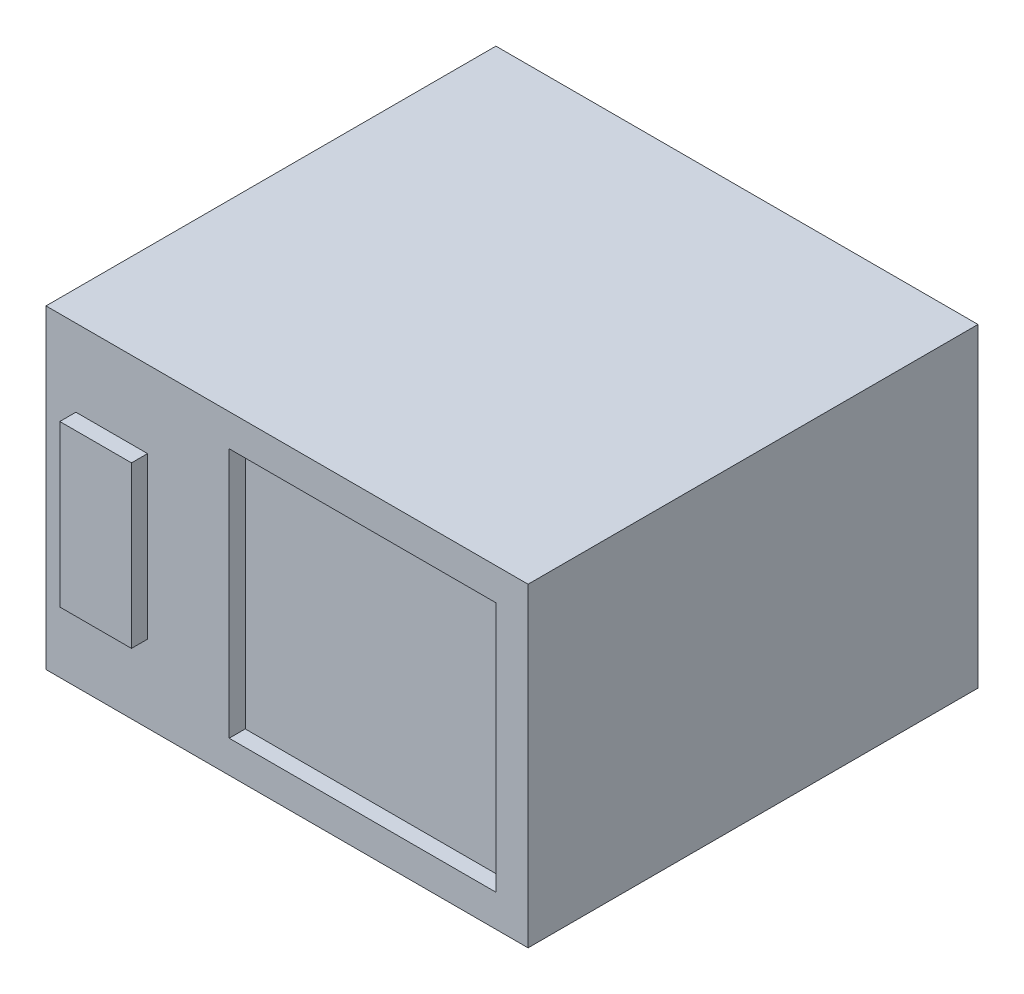
ISO-10303-21;
HEADER;
FILE_DESCRIPTION(('STEP AP214'),'2;1');
FILE_NAME('part.step','',(''),(''),'','','');
FILE_SCHEMA(('AUTOMOTIVE_DESIGN { 1 0 10303 214 1 1 1 1 }'));
ENDSEC;
DATA;
#1=APPLICATION_CONTEXT('core data for automotive mechanical design processes');
#2=APPLICATION_PROTOCOL_DEFINITION('international standard','automotive_design',2000,#1);
#3=PRODUCT_CONTEXT('',#1,'mechanical');
#4=PRODUCT('Part','Part','',(#3));
#5=PRODUCT_RELATED_PRODUCT_CATEGORY('part','',(#4));
#6=PRODUCT_DEFINITION_FORMATION('','',#4);
#7=PRODUCT_DEFINITION_CONTEXT('part definition',#1,'design');
#8=PRODUCT_DEFINITION('design','',#6,#7);
#9=PRODUCT_DEFINITION_SHAPE('','',#8);
#10=(LENGTH_UNIT() NAMED_UNIT(*) SI_UNIT(.MILLI.,.METRE.));
#11=(NAMED_UNIT(*) PLANE_ANGLE_UNIT() SI_UNIT($,.RADIAN.));
#12=(NAMED_UNIT(*) SI_UNIT($,.STERADIAN.) SOLID_ANGLE_UNIT());
#13=UNCERTAINTY_MEASURE_WITH_UNIT(LENGTH_MEASURE(1.E-05),#10,'distance_accuracy_value','');
#14=(GEOMETRIC_REPRESENTATION_CONTEXT(3) GLOBAL_UNCERTAINTY_ASSIGNED_CONTEXT((#13)) GLOBAL_UNIT_ASSIGNED_CONTEXT((#10,
#11,#12)) REPRESENTATION_CONTEXT('',''));
#15=CARTESIAN_POINT('',(0.,0.,0.));
#16=DIRECTION('',(0.,0.,1.));
#17=DIRECTION('',(1.,0.,0.));
#18=AXIS2_PLACEMENT_3D('',#15,#16,#17);
#19=CARTESIAN_POINT('',(-75.,49.,70.));
#20=DIRECTION('',(0.,0.,-1.));
#21=DIRECTION('',(-1.,0.,0.));
#22=AXIS2_PLACEMENT_3D('',#19,#20,#21);
#23=PLANE('',#22);
#24=DIRECTION('',(1.,0.,0.));
#25=VECTOR('',#24,1.);
#26=CARTESIAN_POINT('',(-75.,-49.,70.));
#27=LINE('',#26,#25);
#28=CARTESIAN_POINT('',(-75.,-49.,70.));
#29=VERTEX_POINT('',#28);
#30=CARTESIAN_POINT('',(75.,-49.,70.));
#31=VERTEX_POINT('',#30);
#32=EDGE_CURVE('E295',#29,#31,#27,.T.);
#33=ORIENTED_EDGE('',*,*,#32,.T.);
#34=DIRECTION('',(0.,-1.,0.));
#35=VECTOR('',#34,1.);
#36=CARTESIAN_POINT('',(75.,49.,70.));
#37=LINE('',#36,#35);
#38=CARTESIAN_POINT('',(75.,49.,70.));
#39=VERTEX_POINT('',#38);
#40=EDGE_CURVE('E304',#39,#31,#37,.T.);
#41=ORIENTED_EDGE('',*,*,#40,.F.);
#42=DIRECTION('',(1.,0.,0.));
#43=VECTOR('',#42,1.);
#44=CARTESIAN_POINT('',(-75.,49.,70.));
#45=LINE('',#44,#43);
#46=CARTESIAN_POINT('',(-75.,49.,70.));
#47=VERTEX_POINT('',#46);
#48=EDGE_CURVE('E301',#47,#39,#45,.T.);
#49=ORIENTED_EDGE('',*,*,#48,.F.);
#50=DIRECTION('',(0.,-1.,0.));
#51=VECTOR('',#50,1.);
#52=CARTESIAN_POINT('',(-75.,49.,70.));
#53=LINE('',#52,#51);
#54=EDGE_CURVE('E319',#47,#29,#53,.T.);
#55=ORIENTED_EDGE('',*,*,#54,.T.);
#56=EDGE_LOOP('',(#33,#41,#49,#55));
#57=FACE_BOUND('',#56,.T.);
#58=DIRECTION('',(1.,0.,0.));
#59=VECTOR('',#58,1.);
#60=CARTESIAN_POINT('',(-18.,-39.,70.));
#61=LINE('',#60,#59);
#62=CARTESIAN_POINT('',(-18.,-39.,70.));
#63=VERTEX_POINT('',#62);
#64=CARTESIAN_POINT('',(65.,-39.,70.));
#65=VERTEX_POINT('',#64);
#66=EDGE_CURVE('E266',#63,#65,#61,.T.);
#67=ORIENTED_EDGE('',*,*,#66,.F.);
#68=DIRECTION('',(0.,-1.,0.));
#69=VECTOR('',#68,1.);
#70=CARTESIAN_POINT('',(-18.,39.,70.));
#71=LINE('',#70,#69);
#72=CARTESIAN_POINT('',(-18.,39.,70.));
#73=VERTEX_POINT('',#72);
#74=EDGE_CURVE('E245',#73,#63,#71,.T.);
#75=ORIENTED_EDGE('',*,*,#74,.F.);
#76=DIRECTION('',(-1.,0.,0.));
#77=VECTOR('',#76,1.);
#78=CARTESIAN_POINT('',(-18.,39.,70.));
#79=LINE('',#78,#77);
#80=CARTESIAN_POINT('',(65.,39.,70.));
#81=VERTEX_POINT('',#80);
#82=EDGE_CURVE('E251',#81,#73,#79,.T.);
#83=ORIENTED_EDGE('',*,*,#82,.F.);
#84=DIRECTION('',(0.,1.,0.));
#85=VECTOR('',#84,1.);
#86=CARTESIAN_POINT('',(65.,39.,70.));
#87=LINE('',#86,#85);
#88=EDGE_CURVE('E270',#65,#81,#87,.T.);
#89=ORIENTED_EDGE('',*,*,#88,.F.);
#90=EDGE_LOOP('',(#67,#75,#83,#89));
#91=FACE_BOUND('',#90,.T.);
#92=DIRECTION('',(0.,-1.,0.));
#93=VECTOR('',#92,1.);
#94=CARTESIAN_POINT('',(-65.7,25.,70.));
#95=LINE('',#94,#93);
#96=CARTESIAN_POINT('',(-65.7,25.,70.));
#97=VERTEX_POINT('',#96);
#98=CARTESIAN_POINT('',(-65.7,-25.,70.));
#99=VERTEX_POINT('',#98);
#100=EDGE_CURVE('E198',#97,#99,#95,.T.);
#101=ORIENTED_EDGE('',*,*,#100,.F.);
#102=DIRECTION('',(-1.,0.,0.));
#103=VECTOR('',#102,1.);
#104=CARTESIAN_POINT('',(-65.7,25.,70.));
#105=LINE('',#104,#103);
#106=CARTESIAN_POINT('',(-43.4,25.,70.));
#107=VERTEX_POINT('',#106);
#108=EDGE_CURVE('E209',#107,#97,#105,.T.);
#109=ORIENTED_EDGE('',*,*,#108,.F.);
#110=DIRECTION('',(0.,1.,0.));
#111=VECTOR('',#110,1.);
#112=CARTESIAN_POINT('',(-43.4,25.,70.));
#113=LINE('',#112,#111);
#114=CARTESIAN_POINT('',(-43.4,-25.,70.));
#115=VERTEX_POINT('',#114);
#116=EDGE_CURVE('E224',#115,#107,#113,.T.);
#117=ORIENTED_EDGE('',*,*,#116,.F.);
#118=DIRECTION('',(1.,0.,0.));
#119=VECTOR('',#118,1.);
#120=CARTESIAN_POINT('',(-65.7,-25.,70.));
#121=LINE('',#120,#119);
#122=EDGE_CURVE('E63',#99,#115,#121,.T.);
#123=ORIENTED_EDGE('',*,*,#122,.F.);
#124=EDGE_LOOP('',(#101,#109,#117,#123));
#125=FACE_BOUND('',#124,.T.);
#126=ADVANCED_FACE('F39',(#57,#91,#125),#23,.F.);
#127=CARTESIAN_POINT('',(75.,49.,70.));
#128=DIRECTION('',(-1.,0.,0.));
#129=DIRECTION('',(0.,0.,1.));
#130=AXIS2_PLACEMENT_3D('',#127,#128,#129);
#131=PLANE('',#130);
#132=DIRECTION('',(0.,0.,-1.));
#133=VECTOR('',#132,1.);
#134=CARTESIAN_POINT('',(75.,-49.,70.));
#135=LINE('',#134,#133);
#136=CARTESIAN_POINT('',(75.,-49.,-70.));
#137=VERTEX_POINT('',#136);
#138=EDGE_CURVE('E280',#31,#137,#135,.T.);
#139=ORIENTED_EDGE('',*,*,#138,.T.);
#140=DIRECTION('',(0.,-1.,0.));
#141=VECTOR('',#140,1.);
#142=CARTESIAN_POINT('',(75.,49.,-70.));
#143=LINE('',#142,#141);
#144=CARTESIAN_POINT('',(75.,49.,-70.));
#145=VERTEX_POINT('',#144);
#146=EDGE_CURVE('E11',#145,#137,#143,.T.);
#147=ORIENTED_EDGE('',*,*,#146,.F.);
#148=DIRECTION('',(0.,0.,-1.));
#149=VECTOR('',#148,1.);
#150=CARTESIAN_POINT('',(75.,49.,70.));
#151=LINE('',#150,#149);
#152=EDGE_CURVE('E290',#39,#145,#151,.T.);
#153=ORIENTED_EDGE('',*,*,#152,.F.);
#154=ORIENTED_EDGE('',*,*,#40,.T.);
#155=EDGE_LOOP('',(#139,#147,#153,#154));
#156=FACE_BOUND('',#155,.T.);
#157=ADVANCED_FACE('F41',(#156),#131,.F.);
#158=CARTESIAN_POINT('',(-75.,49.,-70.));
#159=DIRECTION('',(0.,0.,1.));
#160=DIRECTION('',(1.,0.,0.));
#161=AXIS2_PLACEMENT_3D('',#158,#159,#160);
#162=PLANE('',#161);
#163=DIRECTION('',(-1.,0.,0.));
#164=VECTOR('',#163,1.);
#165=CARTESIAN_POINT('',(24.,-39.5,-70.));
#166=LINE('',#165,#164);
#167=CARTESIAN_POINT('',(24.,-39.5,-70.));
#168=VERTEX_POINT('',#167);
#169=CARTESIAN_POINT('',(-60.,-39.5,-70.));
#170=VERTEX_POINT('',#169);
#171=EDGE_CURVE('E189',#168,#170,#166,.T.);
#172=ORIENTED_EDGE('',*,*,#171,.F.);
#173=DIRECTION('',(0.,-1.,0.));
#174=VECTOR('',#173,1.);
#175=CARTESIAN_POINT('',(24.,39.5,-70.));
#176=LINE('',#175,#174);
#177=CARTESIAN_POINT('',(24.,39.5,-70.));
#178=VERTEX_POINT('',#177);
#179=EDGE_CURVE('E55',#178,#168,#176,.T.);
#180=ORIENTED_EDGE('',*,*,#179,.F.);
#181=DIRECTION('',(1.,0.,0.));
#182=VECTOR('',#181,1.);
#183=CARTESIAN_POINT('',(24.,39.5,-70.));
#184=LINE('',#183,#182);
#185=CARTESIAN_POINT('',(-60.,39.5,-70.));
#186=VERTEX_POINT('',#185);
#187=EDGE_CURVE('E176',#186,#178,#184,.T.);
#188=ORIENTED_EDGE('',*,*,#187,.F.);
#189=DIRECTION('',(0.,1.,0.));
#190=VECTOR('',#189,1.);
#191=CARTESIAN_POINT('',(-60.,39.5,-70.));
#192=LINE('',#191,#190);
#193=EDGE_CURVE('E180',#170,#186,#192,.T.);
#194=ORIENTED_EDGE('',*,*,#193,.F.);
#195=EDGE_LOOP('',(#172,#180,#188,#194));
#196=FACE_BOUND('',#195,.T.);
#197=DIRECTION('',(-1.,0.,0.));
#198=VECTOR('',#197,1.);
#199=CARTESIAN_POINT('',(-75.,-49.,-70.));
#200=LINE('',#199,#198);
#201=CARTESIAN_POINT('',(-75.,-49.,-70.));
#202=VERTEX_POINT('',#201);
#203=EDGE_CURVE('E308',#137,#202,#200,.T.);
#204=ORIENTED_EDGE('',*,*,#203,.T.);
#205=DIRECTION('',(0.,-1.,0.));
#206=VECTOR('',#205,1.);
#207=CARTESIAN_POINT('',(-75.,49.,-70.));
#208=LINE('',#207,#206);
#209=CARTESIAN_POINT('',(-75.,49.,-70.));
#210=VERTEX_POINT('',#209);
#211=EDGE_CURVE('E48',#210,#202,#208,.T.);
#212=ORIENTED_EDGE('',*,*,#211,.F.);
#213=DIRECTION('',(-1.,0.,0.));
#214=VECTOR('',#213,1.);
#215=CARTESIAN_POINT('',(-75.,49.,-70.));
#216=LINE('',#215,#214);
#217=EDGE_CURVE('E294',#145,#210,#216,.T.);
#218=ORIENTED_EDGE('',*,*,#217,.F.);
#219=ORIENTED_EDGE('',*,*,#146,.T.);
#220=EDGE_LOOP('',(#204,#212,#218,#219));
#221=FACE_BOUND('',#220,.T.);
#222=ADVANCED_FACE('F344',(#196,#221),#162,.F.);
#223=CARTESIAN_POINT('',(-75.,49.,70.));
#224=DIRECTION('',(1.,0.,0.));
#225=DIRECTION('',(0.,0.,-1.));
#226=AXIS2_PLACEMENT_3D('',#223,#224,#225);
#227=PLANE('',#226);
#228=DIRECTION('',(0.,0.,1.));
#229=VECTOR('',#228,1.);
#230=CARTESIAN_POINT('',(-75.,-49.,70.));
#231=LINE('',#230,#229);
#232=EDGE_CURVE('E311',#202,#29,#231,.T.);
#233=ORIENTED_EDGE('',*,*,#232,.T.);
#234=ORIENTED_EDGE('',*,*,#54,.F.);
#235=DIRECTION('',(0.,0.,1.));
#236=VECTOR('',#235,1.);
#237=CARTESIAN_POINT('',(-75.,49.,70.));
#238=LINE('',#237,#236);
#239=EDGE_CURVE('E298',#210,#47,#238,.T.);
#240=ORIENTED_EDGE('',*,*,#239,.F.);
#241=ORIENTED_EDGE('',*,*,#211,.T.);
#242=EDGE_LOOP('',(#233,#234,#240,#241));
#243=FACE_BOUND('',#242,.T.);
#244=ADVANCED_FACE('F328',(#243),#227,.F.);
#245=CARTESIAN_POINT('',(0.,49.,0.));
#246=DIRECTION('',(0.,-1.,0.));
#247=DIRECTION('',(0.,0.,-1.));
#248=AXIS2_PLACEMENT_3D('',#245,#246,#247);
#249=PLANE('',#248);
#250=ORIENTED_EDGE('',*,*,#152,.T.);
#251=ORIENTED_EDGE('',*,*,#217,.T.);
#252=ORIENTED_EDGE('',*,*,#239,.T.);
#253=ORIENTED_EDGE('',*,*,#48,.T.);
#254=EDGE_LOOP('',(#250,#251,#252,#253));
#255=FACE_BOUND('',#254,.T.);
#256=ADVANCED_FACE('F343',(#255),#249,.F.);
#257=CARTESIAN_POINT('',(0.,-49.,0.));
#258=DIRECTION('',(0.,-1.,0.));
#259=DIRECTION('',(0.,0.,-1.));
#260=AXIS2_PLACEMENT_3D('',#257,#258,#259);
#261=PLANE('',#260);
#262=ORIENTED_EDGE('',*,*,#138,.F.);
#263=ORIENTED_EDGE('',*,*,#32,.F.);
#264=ORIENTED_EDGE('',*,*,#232,.F.);
#265=ORIENTED_EDGE('',*,*,#203,.F.);
#266=EDGE_LOOP('',(#262,#263,#264,#265));
#267=FACE_BOUND('',#266,.T.);
#268=ADVANCED_FACE('F334',(#267),#261,.T.);
#269=CARTESIAN_POINT('',(-18.,39.,65.));
#270=DIRECTION('',(-1.,0.,0.));
#271=DIRECTION('',(0.,0.,1.));
#272=AXIS2_PLACEMENT_3D('',#269,#270,#271);
#273=PLANE('',#272);
#274=ORIENTED_EDGE('',*,*,#74,.T.);
#275=DIRECTION('',(0.,0.,1.));
#276=VECTOR('',#275,1.);
#277=CARTESIAN_POINT('',(-18.,-39.,65.));
#278=LINE('',#277,#276);
#279=CARTESIAN_POINT('',(-18.,-39.,65.));
#280=VERTEX_POINT('',#279);
#281=EDGE_CURVE('E263',#280,#63,#278,.T.);
#282=ORIENTED_EDGE('',*,*,#281,.F.);
#283=DIRECTION('',(0.,-1.,0.));
#284=VECTOR('',#283,1.);
#285=CARTESIAN_POINT('',(-18.,39.,65.));
#286=LINE('',#285,#284);
#287=CARTESIAN_POINT('',(-18.,39.,65.));
#288=VERTEX_POINT('',#287);
#289=EDGE_CURVE('E246',#288,#280,#286,.T.);
#290=ORIENTED_EDGE('',*,*,#289,.F.);
#291=DIRECTION('',(0.,0.,1.));
#292=VECTOR('',#291,1.);
#293=CARTESIAN_POINT('',(-18.,39.,65.));
#294=LINE('',#293,#292);
#295=EDGE_CURVE('E277',#288,#73,#294,.T.);
#296=ORIENTED_EDGE('',*,*,#295,.T.);
#297=EDGE_LOOP('',(#274,#282,#290,#296));
#298=FACE_BOUND('',#297,.T.);
#299=ADVANCED_FACE('F363',(#298),#273,.F.);
#300=CARTESIAN_POINT('',(-18.,39.,65.));
#301=DIRECTION('',(0.,1.,0.));
#302=DIRECTION('',(0.,0.,1.));
#303=AXIS2_PLACEMENT_3D('',#300,#301,#302);
#304=PLANE('',#303);
#305=ORIENTED_EDGE('',*,*,#82,.T.);
#306=ORIENTED_EDGE('',*,*,#295,.F.);
#307=DIRECTION('',(-1.,0.,0.));
#308=VECTOR('',#307,1.);
#309=CARTESIAN_POINT('',(-18.,39.,65.));
#310=LINE('',#309,#308);
#311=CARTESIAN_POINT('',(65.,39.,65.));
#312=VERTEX_POINT('',#311);
#313=EDGE_CURVE('E259',#312,#288,#310,.T.);
#314=ORIENTED_EDGE('',*,*,#313,.F.);
#315=DIRECTION('',(0.,0.,1.));
#316=VECTOR('',#315,1.);
#317=CARTESIAN_POINT('',(65.,39.,65.));
#318=LINE('',#317,#316);
#319=EDGE_CURVE('E281',#312,#81,#318,.T.);
#320=ORIENTED_EDGE('',*,*,#319,.T.);
#321=EDGE_LOOP('',(#305,#306,#314,#320));
#322=FACE_BOUND('',#321,.T.);
#323=ADVANCED_FACE('F368',(#322),#304,.F.);
#324=CARTESIAN_POINT('',(65.,39.,65.));
#325=DIRECTION('',(1.,0.,0.));
#326=DIRECTION('',(0.,0.,-1.));
#327=AXIS2_PLACEMENT_3D('',#324,#325,#326);
#328=PLANE('',#327);
#329=ORIENTED_EDGE('',*,*,#88,.T.);
#330=ORIENTED_EDGE('',*,*,#319,.F.);
#331=DIRECTION('',(0.,1.,0.));
#332=VECTOR('',#331,1.);
#333=CARTESIAN_POINT('',(65.,39.,65.));
#334=LINE('',#333,#332);
#335=CARTESIAN_POINT('',(65.,-39.,65.));
#336=VERTEX_POINT('',#335);
#337=EDGE_CURVE('E255',#336,#312,#334,.T.);
#338=ORIENTED_EDGE('',*,*,#337,.F.);
#339=DIRECTION('',(0.,0.,1.));
#340=VECTOR('',#339,1.);
#341=CARTESIAN_POINT('',(65.,-39.,65.));
#342=LINE('',#341,#340);
#343=EDGE_CURVE('E284',#336,#65,#342,.T.);
#344=ORIENTED_EDGE('',*,*,#343,.T.);
#345=EDGE_LOOP('',(#329,#330,#338,#344));
#346=FACE_BOUND('',#345,.T.);
#347=ADVANCED_FACE('F374',(#346),#328,.F.);
#348=CARTESIAN_POINT('',(-18.,-39.,65.));
#349=DIRECTION('',(0.,-1.,0.));
#350=DIRECTION('',(0.,0.,-1.));
#351=AXIS2_PLACEMENT_3D('',#348,#349,#350);
#352=PLANE('',#351);
#353=ORIENTED_EDGE('',*,*,#66,.T.);
#354=ORIENTED_EDGE('',*,*,#343,.F.);
#355=DIRECTION('',(1.,0.,0.));
#356=VECTOR('',#355,1.);
#357=CARTESIAN_POINT('',(-18.,-39.,65.));
#358=LINE('',#357,#356);
#359=EDGE_CURVE('E250',#280,#336,#358,.T.);
#360=ORIENTED_EDGE('',*,*,#359,.F.);
#361=ORIENTED_EDGE('',*,*,#281,.T.);
#362=EDGE_LOOP('',(#353,#354,#360,#361));
#363=FACE_BOUND('',#362,.T.);
#364=ADVANCED_FACE('F370',(#363),#352,.F.);
#365=CARTESIAN_POINT('',(0.,0.,65.));
#366=DIRECTION('',(0.,0.,1.));
#367=DIRECTION('',(1.,0.,0.));
#368=AXIS2_PLACEMENT_3D('',#365,#366,#367);
#369=PLANE('',#368);
#370=ORIENTED_EDGE('',*,*,#289,.T.);
#371=ORIENTED_EDGE('',*,*,#359,.T.);
#372=ORIENTED_EDGE('',*,*,#337,.T.);
#373=ORIENTED_EDGE('',*,*,#313,.T.);
#374=EDGE_LOOP('',(#370,#371,#372,#373));
#375=FACE_BOUND('',#374,.T.);
#376=ADVANCED_FACE('F373',(#375),#369,.T.);
#377=CARTESIAN_POINT('',(-65.7,25.,75.));
#378=DIRECTION('',(1.,0.,0.));
#379=DIRECTION('',(0.,0.,-1.));
#380=AXIS2_PLACEMENT_3D('',#377,#378,#379);
#381=PLANE('',#380);
#382=ORIENTED_EDGE('',*,*,#100,.T.);
#383=DIRECTION('',(0.,0.,-1.));
#384=VECTOR('',#383,1.);
#385=CARTESIAN_POINT('',(-65.7,-25.,75.));
#386=LINE('',#385,#384);
#387=CARTESIAN_POINT('',(-65.7,-25.,75.));
#388=VERTEX_POINT('',#387);
#389=EDGE_CURVE('E242',#388,#99,#386,.T.);
#390=ORIENTED_EDGE('',*,*,#389,.F.);
#391=DIRECTION('',(0.,-1.,0.));
#392=VECTOR('',#391,1.);
#393=CARTESIAN_POINT('',(-65.7,25.,75.));
#394=LINE('',#393,#392);
#395=CARTESIAN_POINT('',(-65.7,25.,75.));
#396=VERTEX_POINT('',#395);
#397=EDGE_CURVE('E204',#396,#388,#394,.T.);
#398=ORIENTED_EDGE('',*,*,#397,.F.);
#399=DIRECTION('',(0.,0.,-1.));
#400=VECTOR('',#399,1.);
#401=CARTESIAN_POINT('',(-65.7,25.,75.));
#402=LINE('',#401,#400);
#403=EDGE_CURVE('E218',#396,#97,#402,.T.);
#404=ORIENTED_EDGE('',*,*,#403,.T.);
#405=EDGE_LOOP('',(#382,#390,#398,#404));
#406=FACE_BOUND('',#405,.T.);
#407=ADVANCED_FACE('F384',(#406),#381,.F.);
#408=CARTESIAN_POINT('',(-65.7,-25.,75.));
#409=DIRECTION('',(0.,1.,0.));
#410=DIRECTION('',(0.,0.,1.));
#411=AXIS2_PLACEMENT_3D('',#408,#409,#410);
#412=PLANE('',#411);
#413=ORIENTED_EDGE('',*,*,#122,.T.);
#414=DIRECTION('',(0.,0.,-1.));
#415=VECTOR('',#414,1.);
#416=CARTESIAN_POINT('',(-43.4,-25.,75.));
#417=LINE('',#416,#415);
#418=CARTESIAN_POINT('',(-43.4,-25.,75.));
#419=VERTEX_POINT('',#418);
#420=EDGE_CURVE('E238',#419,#115,#417,.T.);
#421=ORIENTED_EDGE('',*,*,#420,.F.);
#422=DIRECTION('',(1.,0.,0.));
#423=VECTOR('',#422,1.);
#424=CARTESIAN_POINT('',(-65.7,-25.,75.));
#425=LINE('',#424,#423);
#426=EDGE_CURVE('E208',#388,#419,#425,.T.);
#427=ORIENTED_EDGE('',*,*,#426,.F.);
#428=ORIENTED_EDGE('',*,*,#389,.T.);
#429=EDGE_LOOP('',(#413,#421,#427,#428));
#430=FACE_BOUND('',#429,.T.);
#431=ADVANCED_FACE('F388',(#430),#412,.F.);
#432=CARTESIAN_POINT('',(-43.4,25.,75.));
#433=DIRECTION('',(-1.,0.,0.));
#434=DIRECTION('',(0.,-1.,0.));
#435=AXIS2_PLACEMENT_3D('',#432,#433,#434);
#436=PLANE('',#435);
#437=ORIENTED_EDGE('',*,*,#116,.T.);
#438=DIRECTION('',(0.,0.,-1.));
#439=VECTOR('',#438,1.);
#440=CARTESIAN_POINT('',(-43.4,25.,75.));
#441=LINE('',#440,#439);
#442=CARTESIAN_POINT('',(-43.4,25.,75.));
#443=VERTEX_POINT('',#442);
#444=EDGE_CURVE('E234',#443,#107,#441,.T.);
#445=ORIENTED_EDGE('',*,*,#444,.F.);
#446=DIRECTION('',(0.,1.,0.));
#447=VECTOR('',#446,1.);
#448=CARTESIAN_POINT('',(-43.4,25.,75.));
#449=LINE('',#448,#447);
#450=EDGE_CURVE('E212',#419,#443,#449,.T.);
#451=ORIENTED_EDGE('',*,*,#450,.F.);
#452=ORIENTED_EDGE('',*,*,#420,.T.);
#453=EDGE_LOOP('',(#437,#445,#451,#452));
#454=FACE_BOUND('',#453,.T.);
#455=ADVANCED_FACE('F392',(#454),#436,.F.);
#456=CARTESIAN_POINT('',(-65.7,25.,75.));
#457=DIRECTION('',(0.,-1.,0.));
#458=DIRECTION('',(1.,0.,0.));
#459=AXIS2_PLACEMENT_3D('',#456,#457,#458);
#460=PLANE('',#459);
#461=ORIENTED_EDGE('',*,*,#108,.T.);
#462=ORIENTED_EDGE('',*,*,#403,.F.);
#463=DIRECTION('',(-1.,0.,0.));
#464=VECTOR('',#463,1.);
#465=CARTESIAN_POINT('',(-65.7,25.,75.));
#466=LINE('',#465,#464);
#467=EDGE_CURVE('E215',#443,#396,#466,.T.);
#468=ORIENTED_EDGE('',*,*,#467,.F.);
#469=ORIENTED_EDGE('',*,*,#444,.T.);
#470=EDGE_LOOP('',(#461,#462,#468,#469));
#471=FACE_BOUND('',#470,.T.);
#472=ADVANCED_FACE('F396',(#471),#460,.F.);
#473=CARTESIAN_POINT('',(0.,0.,75.));
#474=DIRECTION('',(0.,0.,1.));
#475=DIRECTION('',(1.,0.,0.));
#476=AXIS2_PLACEMENT_3D('',#473,#474,#475);
#477=PLANE('',#476);
#478=ORIENTED_EDGE('',*,*,#397,.T.);
#479=ORIENTED_EDGE('',*,*,#426,.T.);
#480=ORIENTED_EDGE('',*,*,#450,.T.);
#481=ORIENTED_EDGE('',*,*,#467,.T.);
#482=EDGE_LOOP('',(#478,#479,#480,#481));
#483=FACE_BOUND('',#482,.T.);
#484=ADVANCED_FACE('F400',(#483),#477,.T.);
#485=CARTESIAN_POINT('',(24.,39.5,-65.));
#486=DIRECTION('',(1.,0.,0.));
#487=DIRECTION('',(0.,0.,-1.));
#488=AXIS2_PLACEMENT_3D('',#485,#486,#487);
#489=PLANE('',#488);
#490=ORIENTED_EDGE('',*,*,#179,.T.);
#491=DIRECTION('',(0.,0.,-1.));
#492=VECTOR('',#491,1.);
#493=CARTESIAN_POINT('',(24.,-39.5,-65.));
#494=LINE('',#493,#492);
#495=CARTESIAN_POINT('',(24.,-39.5,-65.));
#496=VERTEX_POINT('',#495);
#497=EDGE_CURVE('E151',#496,#168,#494,.T.);
#498=ORIENTED_EDGE('',*,*,#497,.F.);
#499=DIRECTION('',(0.,-1.,0.));
#500=VECTOR('',#499,1.);
#501=CARTESIAN_POINT('',(24.,39.5,-65.));
#502=LINE('',#501,#500);
#503=CARTESIAN_POINT('',(24.,39.5,-65.));
#504=VERTEX_POINT('',#503);
#505=EDGE_CURVE('E155',#504,#496,#502,.T.);
#506=ORIENTED_EDGE('',*,*,#505,.F.);
#507=DIRECTION('',(0.,0.,-1.));
#508=VECTOR('',#507,1.);
#509=CARTESIAN_POINT('',(24.,39.5,-65.));
#510=LINE('',#509,#508);
#511=EDGE_CURVE('E195',#504,#178,#510,.T.);
#512=ORIENTED_EDGE('',*,*,#511,.T.);
#513=EDGE_LOOP('',(#490,#498,#506,#512));
#514=FACE_BOUND('',#513,.T.);
#515=ADVANCED_FACE('F153',(#514),#489,.F.);
#516=CARTESIAN_POINT('',(24.,39.5,-65.));
#517=DIRECTION('',(0.,1.,0.));
#518=DIRECTION('',(0.,0.,1.));
#519=AXIS2_PLACEMENT_3D('',#516,#517,#518);
#520=PLANE('',#519);
#521=ORIENTED_EDGE('',*,*,#187,.T.);
#522=ORIENTED_EDGE('',*,*,#511,.F.);
#523=DIRECTION('',(1.,0.,0.));
#524=VECTOR('',#523,1.);
#525=CARTESIAN_POINT('',(24.,39.5,-65.));
#526=LINE('',#525,#524);
#527=CARTESIAN_POINT('',(-60.,39.5,-65.));
#528=VERTEX_POINT('',#527);
#529=EDGE_CURVE('E162',#528,#504,#526,.T.);
#530=ORIENTED_EDGE('',*,*,#529,.F.);
#531=DIRECTION('',(0.,0.,-1.));
#532=VECTOR('',#531,1.);
#533=CARTESIAN_POINT('',(-60.,39.5,-65.));
#534=LINE('',#533,#532);
#535=EDGE_CURVE('E199',#528,#186,#534,.T.);
#536=ORIENTED_EDGE('',*,*,#535,.T.);
#537=EDGE_LOOP('',(#521,#522,#530,#536));
#538=FACE_BOUND('',#537,.T.);
#539=ADVANCED_FACE('F407',(#538),#520,.F.);
#540=CARTESIAN_POINT('',(-60.,39.5,-65.));
#541=DIRECTION('',(-1.,0.,0.));
#542=DIRECTION('',(0.,0.,1.));
#543=AXIS2_PLACEMENT_3D('',#540,#541,#542);
#544=PLANE('',#543);
#545=ORIENTED_EDGE('',*,*,#193,.T.);
#546=ORIENTED_EDGE('',*,*,#535,.F.);
#547=DIRECTION('',(0.,1.,0.));
#548=VECTOR('',#547,1.);
#549=CARTESIAN_POINT('',(-60.,39.5,-65.));
#550=LINE('',#549,#548);
#551=CARTESIAN_POINT('',(-60.,-39.5,-65.));
#552=VERTEX_POINT('',#551);
#553=EDGE_CURVE('E171',#552,#528,#550,.T.);
#554=ORIENTED_EDGE('',*,*,#553,.F.);
#555=DIRECTION('',(0.,0.,-1.));
#556=VECTOR('',#555,1.);
#557=CARTESIAN_POINT('',(-60.,-39.5,-65.));
#558=LINE('',#557,#556);
#559=EDGE_CURVE('E161',#552,#170,#558,.T.);
#560=ORIENTED_EDGE('',*,*,#559,.T.);
#561=EDGE_LOOP('',(#545,#546,#554,#560));
#562=FACE_BOUND('',#561,.T.);
#563=ADVANCED_FACE('F410',(#562),#544,.F.);
#564=CARTESIAN_POINT('',(24.,-39.5,-65.));
#565=DIRECTION('',(0.,-1.,0.));
#566=DIRECTION('',(0.,0.,-1.));
#567=AXIS2_PLACEMENT_3D('',#564,#565,#566);
#568=PLANE('',#567);
#569=ORIENTED_EDGE('',*,*,#171,.T.);
#570=ORIENTED_EDGE('',*,*,#559,.F.);
#571=DIRECTION('',(-1.,0.,0.));
#572=VECTOR('',#571,1.);
#573=CARTESIAN_POINT('',(24.,-39.5,-65.));
#574=LINE('',#573,#572);
#575=EDGE_CURVE('E165',#496,#552,#574,.T.);
#576=ORIENTED_EDGE('',*,*,#575,.F.);
#577=ORIENTED_EDGE('',*,*,#497,.T.);
#578=EDGE_LOOP('',(#569,#570,#576,#577));
#579=FACE_BOUND('',#578,.T.);
#580=ADVANCED_FACE('F166',(#579),#568,.F.);
#581=CARTESIAN_POINT('',(0.,0.,-65.));
#582=DIRECTION('',(0.,0.,-1.));
#583=DIRECTION('',(-1.,0.,0.));
#584=AXIS2_PLACEMENT_3D('',#581,#582,#583);
#585=PLANE('',#584);
#586=ORIENTED_EDGE('',*,*,#505,.T.);
#587=ORIENTED_EDGE('',*,*,#575,.T.);
#588=ORIENTED_EDGE('',*,*,#553,.T.);
#589=ORIENTED_EDGE('',*,*,#529,.T.);
#590=EDGE_LOOP('',(#586,#587,#588,#589));
#591=FACE_BOUND('',#590,.T.);
#592=ADVANCED_FACE('F173',(#591),#585,.T.);
#593=CLOSED_SHELL('',(#126,#157,#222,#244,#256,#268,#299,#323,#347,#364,#376,#407,#431,#455,
#472,#484,#515,#539,#563,#580,#592));
#594=MANIFOLD_SOLID_BREP('B2',#593);
#595=ADVANCED_BREP_SHAPE_REPRESENTATION('',(#18,#594),#14);
#596=SHAPE_DEFINITION_REPRESENTATION(#9,#595);
ENDSEC;
END-ISO-10303-21;
